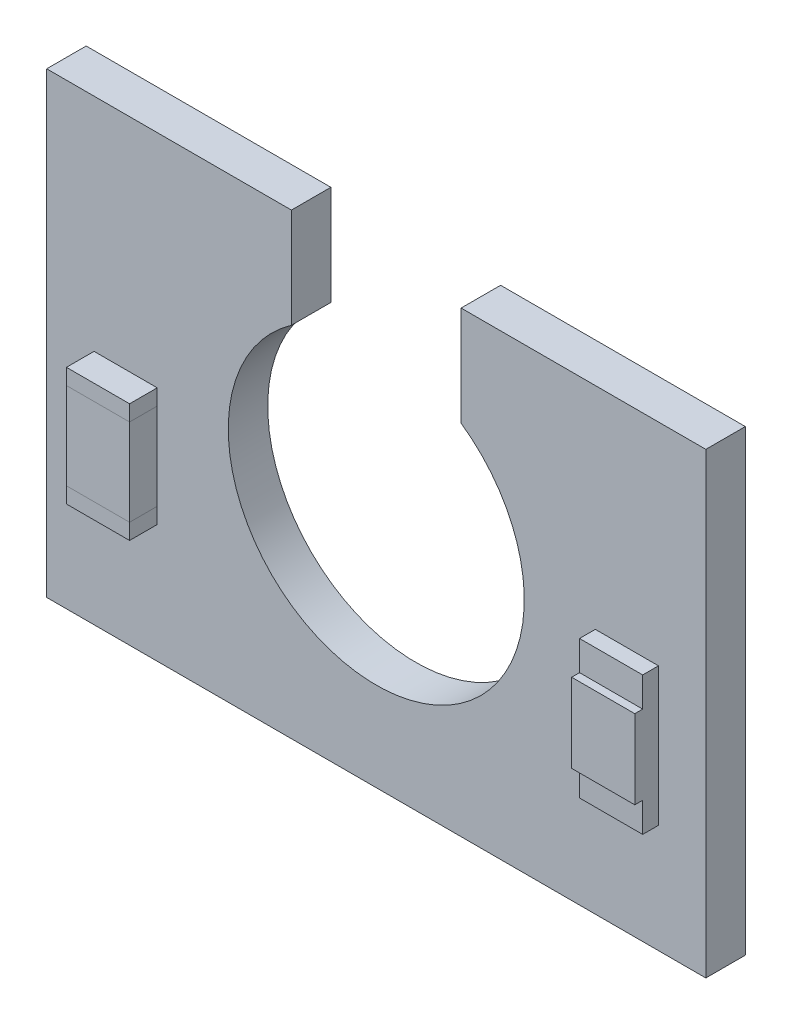
ISO-10303-21;
HEADER;
FILE_DESCRIPTION(('STEP AP214'),'2;1');
FILE_NAME('part.step','',(''),(''),'','','');
FILE_SCHEMA(('AUTOMOTIVE_DESIGN { 1 0 10303 214 1 1 1 1 }'));
ENDSEC;
DATA;
#1=APPLICATION_CONTEXT('core data for automotive mechanical design processes');
#2=APPLICATION_PROTOCOL_DEFINITION('international standard','automotive_design',2000,#1);
#3=PRODUCT_CONTEXT('',#1,'mechanical');
#4=PRODUCT('Part','Part','',(#3));
#5=PRODUCT_RELATED_PRODUCT_CATEGORY('part','',(#4));
#6=PRODUCT_DEFINITION_FORMATION('','',#4);
#7=PRODUCT_DEFINITION_CONTEXT('part definition',#1,'design');
#8=PRODUCT_DEFINITION('design','',#6,#7);
#9=PRODUCT_DEFINITION_SHAPE('','',#8);
#10=(LENGTH_UNIT() NAMED_UNIT(*) SI_UNIT(.MILLI.,.METRE.));
#11=(NAMED_UNIT(*) PLANE_ANGLE_UNIT() SI_UNIT($,.RADIAN.));
#12=(NAMED_UNIT(*) SI_UNIT($,.STERADIAN.) SOLID_ANGLE_UNIT());
#13=UNCERTAINTY_MEASURE_WITH_UNIT(LENGTH_MEASURE(1.E-05),#10,'distance_accuracy_value','');
#14=(GEOMETRIC_REPRESENTATION_CONTEXT(3) GLOBAL_UNCERTAINTY_ASSIGNED_CONTEXT((#13)) GLOBAL_UNIT_ASSIGNED_CONTEXT((#10,
#11,#12)) REPRESENTATION_CONTEXT('',''));
#15=CARTESIAN_POINT('',(0.,0.,0.));
#16=DIRECTION('',(0.,0.,1.));
#17=DIRECTION('',(1.,0.,0.));
#18=AXIS2_PLACEMENT_3D('',#15,#16,#17);
#19=CARTESIAN_POINT('',(-8.35,5.8,-1.));
#20=DIRECTION('',(0.,1.,0.));
#21=DIRECTION('',(0.,0.,1.));
#22=AXIS2_PLACEMENT_3D('',#19,#20,#21);
#23=PLANE('',#22);
#24=DIRECTION('',(0.,0.,1.));
#25=VECTOR('',#24,1.);
#26=CARTESIAN_POINT('',(-2.15,5.8,-1.));
#27=LINE('',#26,#25);
#28=CARTESIAN_POINT('',(-2.15,5.8,-1.));
#29=VERTEX_POINT('',#28);
#30=CARTESIAN_POINT('',(-2.15,5.8,0.));
#31=VERTEX_POINT('',#30);
#32=EDGE_CURVE('P0_E118',#29,#31,#27,.T.);
#33=ORIENTED_EDGE('',*,*,#32,.F.);
#34=DIRECTION('',(-1.,0.,0.));
#35=VECTOR('',#34,1.);
#36=CARTESIAN_POINT('',(-8.35,5.8,-1.));
#37=LINE('',#36,#35);
#38=CARTESIAN_POINT('',(-8.35,5.8,-1.));
#39=VERTEX_POINT('',#38);
#40=EDGE_CURVE('P0_E109',#29,#39,#37,.T.);
#41=ORIENTED_EDGE('',*,*,#40,.T.);
#42=DIRECTION('',(0.,0.,1.));
#43=VECTOR('',#42,1.);
#44=CARTESIAN_POINT('',(-8.35,5.8,-1.));
#45=LINE('',#44,#43);
#46=CARTESIAN_POINT('',(-8.35,5.8,0.));
#47=VERTEX_POINT('',#46);
#48=EDGE_CURVE('P0_E146',#39,#47,#45,.T.);
#49=ORIENTED_EDGE('',*,*,#48,.T.);
#50=DIRECTION('',(-1.,0.,0.));
#51=VECTOR('',#50,1.);
#52=CARTESIAN_POINT('',(-8.35,5.8,0.));
#53=LINE('',#52,#51);
#54=EDGE_CURVE('P0_E137',#31,#47,#53,.T.);
#55=ORIENTED_EDGE('',*,*,#54,.F.);
#56=EDGE_LOOP('',(#33,#41,#49,#55));
#57=FACE_BOUND('',#56,.T.);
#58=ADVANCED_FACE('P0_F17',(#57),#23,.T.);
#59=CARTESIAN_POINT('',(8.35,5.8,-1.));
#60=DIRECTION('',(1.,0.,0.));
#61=DIRECTION('',(0.,0.,-1.));
#62=AXIS2_PLACEMENT_3D('',#59,#60,#61);
#63=PLANE('',#62);
#64=DIRECTION('',(0.,1.,0.));
#65=VECTOR('',#64,1.);
#66=CARTESIAN_POINT('',(8.35,5.8,0.));
#67=LINE('',#66,#65);
#68=CARTESIAN_POINT('',(8.35,-5.8,0.));
#69=VERTEX_POINT('',#68);
#70=CARTESIAN_POINT('',(8.35,5.8,0.));
#71=VERTEX_POINT('',#70);
#72=EDGE_CURVE('P0_E120',#69,#71,#67,.T.);
#73=ORIENTED_EDGE('',*,*,#72,.F.);
#74=DIRECTION('',(0.,0.,1.));
#75=VECTOR('',#74,1.);
#76=CARTESIAN_POINT('',(8.35,-5.8,-1.));
#77=LINE('',#76,#75);
#78=CARTESIAN_POINT('',(8.35,-5.8,-1.));
#79=VERTEX_POINT('',#78);
#80=EDGE_CURVE('P0_E11',#79,#69,#77,.T.);
#81=ORIENTED_EDGE('',*,*,#80,.F.);
#82=DIRECTION('',(0.,1.,0.));
#83=VECTOR('',#82,1.);
#84=CARTESIAN_POINT('',(8.35,5.8,-1.));
#85=LINE('',#84,#83);
#86=CARTESIAN_POINT('',(8.35,5.8,-1.));
#87=VERTEX_POINT('',#86);
#88=EDGE_CURVE('P0_E125',#79,#87,#85,.T.);
#89=ORIENTED_EDGE('',*,*,#88,.T.);
#90=DIRECTION('',(0.,0.,1.));
#91=VECTOR('',#90,1.);
#92=CARTESIAN_POINT('',(8.35,5.8,-1.));
#93=LINE('',#92,#91);
#94=EDGE_CURVE('P0_E21',#87,#71,#93,.T.);
#95=ORIENTED_EDGE('',*,*,#94,.T.);
#96=EDGE_LOOP('',(#73,#81,#89,#95));
#97=FACE_BOUND('',#96,.T.);
#98=ADVANCED_FACE('P0_F19',(#97),#63,.T.);
#99=CARTESIAN_POINT('',(-8.35,-5.8,-1.));
#100=DIRECTION('',(0.,-1.,0.));
#101=DIRECTION('',(0.,0.,-1.));
#102=AXIS2_PLACEMENT_3D('',#99,#100,#101);
#103=PLANE('',#102);
#104=DIRECTION('',(1.,0.,0.));
#105=VECTOR('',#104,1.);
#106=CARTESIAN_POINT('',(-8.35,-5.8,0.));
#107=LINE('',#106,#105);
#108=CARTESIAN_POINT('',(-8.35,-5.8,0.));
#109=VERTEX_POINT('',#108);
#110=EDGE_CURVE('P0_E127',#109,#69,#107,.T.);
#111=ORIENTED_EDGE('',*,*,#110,.F.);
#112=DIRECTION('',(0.,0.,1.));
#113=VECTOR('',#112,1.);
#114=CARTESIAN_POINT('',(-8.35,-5.8,-1.));
#115=LINE('',#114,#113);
#116=CARTESIAN_POINT('',(-8.35,-5.8,-1.));
#117=VERTEX_POINT('',#116);
#118=EDGE_CURVE('P0_E26',#117,#109,#115,.T.);
#119=ORIENTED_EDGE('',*,*,#118,.F.);
#120=DIRECTION('',(1.,0.,0.));
#121=VECTOR('',#120,1.);
#122=CARTESIAN_POINT('',(-8.35,-5.8,-1.));
#123=LINE('',#122,#121);
#124=EDGE_CURVE('P0_E133',#117,#79,#123,.T.);
#125=ORIENTED_EDGE('',*,*,#124,.T.);
#126=ORIENTED_EDGE('',*,*,#80,.T.);
#127=EDGE_LOOP('',(#111,#119,#125,#126));
#128=FACE_BOUND('',#127,.T.);
#129=ADVANCED_FACE('P0_F156',(#128),#103,.T.);
#130=CARTESIAN_POINT('',(-8.35,5.8,-1.));
#131=DIRECTION('',(-1.,0.,0.));
#132=DIRECTION('',(0.,-1.,0.));
#133=AXIS2_PLACEMENT_3D('',#130,#131,#132);
#134=PLANE('',#133);
#135=DIRECTION('',(0.,-1.,0.));
#136=VECTOR('',#135,1.);
#137=CARTESIAN_POINT('',(-8.35,5.8,0.));
#138=LINE('',#137,#136);
#139=EDGE_CURVE('P0_E141',#47,#109,#138,.T.);
#140=ORIENTED_EDGE('',*,*,#139,.F.);
#141=ORIENTED_EDGE('',*,*,#48,.F.);
#142=DIRECTION('',(0.,-1.,0.));
#143=VECTOR('',#142,1.);
#144=CARTESIAN_POINT('',(-8.35,5.8,-1.));
#145=LINE('',#144,#143);
#146=EDGE_CURVE('P0_E130',#39,#117,#145,.T.);
#147=ORIENTED_EDGE('',*,*,#146,.T.);
#148=ORIENTED_EDGE('',*,*,#118,.T.);
#149=EDGE_LOOP('',(#140,#141,#147,#148));
#150=FACE_BOUND('',#149,.T.);
#151=ADVANCED_FACE('P0_F159',(#150),#134,.T.);
#152=DIRECTION('',(0.,0.,1.));
#153=VECTOR('',#152,1.);
#154=CARTESIAN_POINT('',(2.15,5.8,-1.));
#155=LINE('',#154,#153);
#156=CARTESIAN_POINT('',(2.15,5.8,-1.));
#157=VERTEX_POINT('',#156);
#158=CARTESIAN_POINT('',(2.15,5.8,0.));
#159=VERTEX_POINT('',#158);
#160=EDGE_CURVE('P0_E121',#157,#159,#155,.T.);
#161=ORIENTED_EDGE('',*,*,#160,.T.);
#162=EDGE_CURVE('P0_E138',#71,#159,#53,.T.);
#163=ORIENTED_EDGE('',*,*,#162,.F.);
#164=ORIENTED_EDGE('',*,*,#94,.F.);
#165=EDGE_CURVE('P0_E128',#87,#157,#37,.T.);
#166=ORIENTED_EDGE('',*,*,#165,.T.);
#167=EDGE_LOOP('',(#161,#163,#164,#166));
#168=FACE_BOUND('',#167,.T.);
#169=ADVANCED_FACE('P0_F152',(#168),#23,.T.);
#170=CARTESIAN_POINT('',(0.,0.,-1.));
#171=DIRECTION('',(0.,0.,1.));
#172=DIRECTION('',(1.,0.,0.));
#173=AXIS2_PLACEMENT_3D('',#170,#171,#172);
#174=PLANE('',#173);
#175=ORIENTED_EDGE('',*,*,#40,.F.);
#176=DIRECTION('',(0.,-1.,0.));
#177=VECTOR('',#176,1.);
#178=CARTESIAN_POINT('',(-2.15,5.8,-1.));
#179=LINE('',#178,#177);
#180=CARTESIAN_POINT('',(-2.15,3.27245829914745,-1.));
#181=VERTEX_POINT('',#180);
#182=EDGE_CURVE('P0_E91',#29,#181,#179,.T.);
#183=ORIENTED_EDGE('',*,*,#182,.T.);
#184=CARTESIAN_POINT('',(0.,0.200000000000002,-1.));
#185=DIRECTION('',(0.,0.,1.));
#186=DIRECTION('',(1.,0.,0.));
#187=AXIS2_PLACEMENT_3D('',#184,#185,#186);
#188=CIRCLE('',#187,3.75);
#189=CARTESIAN_POINT('',(2.15,3.27245829914744,-1.));
#190=VERTEX_POINT('',#189);
#191=EDGE_CURVE('P0_E100',#181,#190,#188,.T.);
#192=ORIENTED_EDGE('',*,*,#191,.T.);
#193=DIRECTION('',(0.,1.,0.));
#194=VECTOR('',#193,1.);
#195=CARTESIAN_POINT('',(2.15,5.8,-1.));
#196=LINE('',#195,#194);
#197=EDGE_CURVE('P0_E97',#190,#157,#196,.T.);
#198=ORIENTED_EDGE('',*,*,#197,.T.);
#199=ORIENTED_EDGE('',*,*,#165,.F.);
#200=ORIENTED_EDGE('',*,*,#88,.F.);
#201=ORIENTED_EDGE('',*,*,#124,.F.);
#202=ORIENTED_EDGE('',*,*,#146,.F.);
#203=EDGE_LOOP('',(#175,#183,#192,#198,#199,#200,#201,#202));
#204=FACE_BOUND('',#203,.T.);
#205=ADVANCED_FACE('P0_F107',(#204),#174,.F.);
#206=CARTESIAN_POINT('',(0.,0.,0.));
#207=DIRECTION('',(0.,0.,1.));
#208=DIRECTION('',(1.,0.,0.));
#209=AXIS2_PLACEMENT_3D('',#206,#207,#208);
#210=PLANE('',#209);
#211=DIRECTION('',(0.,-1.,0.));
#212=VECTOR('',#211,1.);
#213=CARTESIAN_POINT('',(-2.15,5.8,0.));
#214=LINE('',#213,#212);
#215=CARTESIAN_POINT('',(-2.15,3.27245829914745,0.));
#216=VERTEX_POINT('',#215);
#217=EDGE_CURVE('P0_E34',#31,#216,#214,.T.);
#218=ORIENTED_EDGE('',*,*,#217,.F.);
#219=ORIENTED_EDGE('',*,*,#54,.T.);
#220=ORIENTED_EDGE('',*,*,#139,.T.);
#221=ORIENTED_EDGE('',*,*,#110,.T.);
#222=ORIENTED_EDGE('',*,*,#72,.T.);
#223=ORIENTED_EDGE('',*,*,#162,.T.);
#224=DIRECTION('',(0.,1.,0.));
#225=VECTOR('',#224,1.);
#226=CARTESIAN_POINT('',(2.15,5.8,0.));
#227=LINE('',#226,#225);
#228=CARTESIAN_POINT('',(2.15,3.27245829914744,0.));
#229=VERTEX_POINT('',#228);
#230=EDGE_CURVE('P0_E110',#229,#159,#227,.T.);
#231=ORIENTED_EDGE('',*,*,#230,.F.);
#232=CARTESIAN_POINT('',(0.,0.200000000000002,0.));
#233=DIRECTION('',(0.,0.,1.));
#234=DIRECTION('',(1.,0.,0.));
#235=AXIS2_PLACEMENT_3D('',#232,#233,#234);
#236=CIRCLE('',#235,3.75);
#237=EDGE_CURVE('P0_E112',#216,#229,#236,.T.);
#238=ORIENTED_EDGE('',*,*,#237,.F.);
#239=EDGE_LOOP('',(#218,#219,#220,#221,#222,#223,#231,#238));
#240=FACE_BOUND('',#239,.T.);
#241=ADVANCED_FACE('P0_F155',(#240),#210,.T.);
#242=CARTESIAN_POINT('',(-2.15,5.8,-1.));
#243=DIRECTION('',(-1.,0.,0.));
#244=DIRECTION('',(0.,-1.,0.));
#245=AXIS2_PLACEMENT_3D('',#242,#243,#244);
#246=PLANE('',#245);
#247=ORIENTED_EDGE('',*,*,#217,.T.);
#248=DIRECTION('',(0.,0.,1.));
#249=VECTOR('',#248,1.);
#250=CARTESIAN_POINT('',(-2.15,3.27245829914745,-1.));
#251=LINE('',#250,#249);
#252=EDGE_CURVE('P0_E87',#181,#216,#251,.T.);
#253=ORIENTED_EDGE('',*,*,#252,.F.);
#254=ORIENTED_EDGE('',*,*,#182,.F.);
#255=ORIENTED_EDGE('',*,*,#32,.T.);
#256=EDGE_LOOP('',(#247,#253,#254,#255));
#257=FACE_BOUND('',#256,.T.);
#258=ADVANCED_FACE('P0_F89',(#257),#246,.F.);
#259=CARTESIAN_POINT('',(2.15,5.8,-1.));
#260=DIRECTION('',(1.,0.,0.));
#261=DIRECTION('',(0.,1.,0.));
#262=AXIS2_PLACEMENT_3D('',#259,#260,#261);
#263=PLANE('',#262);
#264=ORIENTED_EDGE('',*,*,#230,.T.);
#265=ORIENTED_EDGE('',*,*,#160,.F.);
#266=ORIENTED_EDGE('',*,*,#197,.F.);
#267=DIRECTION('',(0.,0.,1.));
#268=VECTOR('',#267,1.);
#269=CARTESIAN_POINT('',(2.15,3.27245829914744,-1.));
#270=LINE('',#269,#268);
#271=EDGE_CURVE('P0_E96',#190,#229,#270,.T.);
#272=ORIENTED_EDGE('',*,*,#271,.T.);
#273=EDGE_LOOP('',(#264,#265,#266,#272));
#274=FACE_BOUND('',#273,.T.);
#275=ADVANCED_FACE('P0_F161',(#274),#263,.F.);
#276=CARTESIAN_POINT('',(0.,0.200000000000002,-1.));
#277=DIRECTION('',(0.,0.,1.));
#278=DIRECTION('',(1.,0.,0.));
#279=AXIS2_PLACEMENT_3D('',#276,#277,#278);
#280=CYLINDRICAL_SURFACE('',#279,3.75);
#281=ORIENTED_EDGE('',*,*,#237,.T.);
#282=ORIENTED_EDGE('',*,*,#271,.F.);
#283=ORIENTED_EDGE('',*,*,#191,.F.);
#284=ORIENTED_EDGE('',*,*,#252,.T.);
#285=EDGE_LOOP('',(#281,#282,#283,#284));
#286=FACE_BOUND('',#285,.T.);
#287=ADVANCED_FACE('P0_F101',(#286),#280,.F.);
#288=CLOSED_SHELL('',(#58,#98,#129,#151,#169,#205,#241,#258,#275,#287));
#289=MANIFOLD_SOLID_BREP('P0_B1',#288);
#290=CARTESIAN_POINT('',(-5.55,-0.199999999999999,0.7));
#291=DIRECTION('',(-1.,0.,0.));
#292=DIRECTION('',(0.,0.,1.));
#293=AXIS2_PLACEMENT_3D('',#290,#291,#292);
#294=PLANE('',#293);
#295=DIRECTION('',(0.,1.,0.));
#296=VECTOR('',#295,1.);
#297=CARTESIAN_POINT('',(-5.55,-0.199999999999999,0.));
#298=LINE('',#297,#296);
#299=CARTESIAN_POINT('',(-5.55,-2.4,0.));
#300=VERTEX_POINT('',#299);
#301=CARTESIAN_POINT('',(-5.55,-0.199999999999999,0.));
#302=VERTEX_POINT('',#301);
#303=EDGE_CURVE('P1_E80',#300,#302,#298,.T.);
#304=ORIENTED_EDGE('',*,*,#303,.T.);
#305=DIRECTION('',(0.,0.,-1.));
#306=VECTOR('',#305,1.);
#307=CARTESIAN_POINT('',(-5.55,-0.199999999999999,0.7));
#308=LINE('',#307,#306);
#309=CARTESIAN_POINT('',(-5.55,-0.199999999999999,0.7));
#310=VERTEX_POINT('',#309);
#311=EDGE_CURVE('P1_E11',#310,#302,#308,.T.);
#312=ORIENTED_EDGE('',*,*,#311,.F.);
#313=DIRECTION('',(0.,1.,0.));
#314=VECTOR('',#313,1.);
#315=CARTESIAN_POINT('',(-5.55,-0.199999999999999,0.7));
#316=LINE('',#315,#314);
#317=CARTESIAN_POINT('',(-5.55,-2.4,0.7));
#318=VERTEX_POINT('',#317);
#319=EDGE_CURVE('P1_E68',#318,#310,#316,.T.);
#320=ORIENTED_EDGE('',*,*,#319,.F.);
#321=DIRECTION('',(0.,0.,-1.));
#322=VECTOR('',#321,1.);
#323=CARTESIAN_POINT('',(-5.55,-2.4,0.7));
#324=LINE('',#323,#322);
#325=EDGE_CURVE('P1_E76',#318,#300,#324,.T.);
#326=ORIENTED_EDGE('',*,*,#325,.T.);
#327=EDGE_LOOP('',(#304,#312,#320,#326));
#328=FACE_BOUND('',#327,.T.);
#329=ADVANCED_FACE('P1_F17',(#328),#294,.F.);
#330=CARTESIAN_POINT('',(-7.15,-0.199999999999999,0.7));
#331=DIRECTION('',(0.,-1.,0.));
#332=DIRECTION('',(0.,0.,-1.));
#333=AXIS2_PLACEMENT_3D('',#330,#331,#332);
#334=PLANE('',#333);
#335=DIRECTION('',(-1.,0.,0.));
#336=VECTOR('',#335,1.);
#337=CARTESIAN_POINT('',(-7.15,-0.199999999999999,0.));
#338=LINE('',#337,#336);
#339=CARTESIAN_POINT('',(-7.15,-0.199999999999999,0.));
#340=VERTEX_POINT('',#339);
#341=EDGE_CURVE('P1_E72',#302,#340,#338,.T.);
#342=ORIENTED_EDGE('',*,*,#341,.T.);
#343=DIRECTION('',(0.,0.,-1.));
#344=VECTOR('',#343,1.);
#345=CARTESIAN_POINT('',(-7.15,-0.199999999999999,0.7));
#346=LINE('',#345,#344);
#347=CARTESIAN_POINT('',(-7.15,-0.199999999999999,0.7));
#348=VERTEX_POINT('',#347);
#349=EDGE_CURVE('P1_E25',#348,#340,#346,.T.);
#350=ORIENTED_EDGE('',*,*,#349,.F.);
#351=DIRECTION('',(-1.,0.,0.));
#352=VECTOR('',#351,1.);
#353=CARTESIAN_POINT('',(-7.15,-0.199999999999999,0.7));
#354=LINE('',#353,#352);
#355=EDGE_CURVE('P1_E63',#310,#348,#354,.T.);
#356=ORIENTED_EDGE('',*,*,#355,.F.);
#357=ORIENTED_EDGE('',*,*,#311,.T.);
#358=EDGE_LOOP('',(#342,#350,#356,#357));
#359=FACE_BOUND('',#358,.T.);
#360=ADVANCED_FACE('P1_F71',(#359),#334,.F.);
#361=CARTESIAN_POINT('',(-7.15,-0.199999999999999,0.7));
#362=DIRECTION('',(1.,0.,0.));
#363=DIRECTION('',(0.,0.,-1.));
#364=AXIS2_PLACEMENT_3D('',#361,#362,#363);
#365=PLANE('',#364);
#366=DIRECTION('',(0.,-1.,0.));
#367=VECTOR('',#366,1.);
#368=CARTESIAN_POINT('',(-7.15,-0.199999999999999,0.));
#369=LINE('',#368,#367);
#370=CARTESIAN_POINT('',(-7.15,-2.4,0.));
#371=VERTEX_POINT('',#370);
#372=EDGE_CURVE('P1_E50',#340,#371,#369,.T.);
#373=ORIENTED_EDGE('',*,*,#372,.T.);
#374=DIRECTION('',(0.,0.,-1.));
#375=VECTOR('',#374,1.);
#376=CARTESIAN_POINT('',(-7.15,-2.4,0.7));
#377=LINE('',#376,#375);
#378=CARTESIAN_POINT('',(-7.15,-2.4,0.7));
#379=VERTEX_POINT('',#378);
#380=EDGE_CURVE('P1_E73',#379,#371,#377,.T.);
#381=ORIENTED_EDGE('',*,*,#380,.F.);
#382=DIRECTION('',(0.,-1.,0.));
#383=VECTOR('',#382,1.);
#384=CARTESIAN_POINT('',(-7.15,-0.199999999999999,0.7));
#385=LINE('',#384,#383);
#386=EDGE_CURVE('P1_E66',#348,#379,#385,.T.);
#387=ORIENTED_EDGE('',*,*,#386,.F.);
#388=ORIENTED_EDGE('',*,*,#349,.T.);
#389=EDGE_LOOP('',(#373,#381,#387,#388));
#390=FACE_BOUND('',#389,.T.);
#391=ADVANCED_FACE('P1_F74',(#390),#365,.F.);
#392=CARTESIAN_POINT('',(-7.15,-2.4,0.7));
#393=DIRECTION('',(0.,1.,0.));
#394=DIRECTION('',(0.,0.,1.));
#395=AXIS2_PLACEMENT_3D('',#392,#393,#394);
#396=PLANE('',#395);
#397=DIRECTION('',(1.,0.,0.));
#398=VECTOR('',#397,1.);
#399=CARTESIAN_POINT('',(-7.15,-2.4,0.));
#400=LINE('',#399,#398);
#401=EDGE_CURVE('P1_E56',#371,#300,#400,.T.);
#402=ORIENTED_EDGE('',*,*,#401,.T.);
#403=ORIENTED_EDGE('',*,*,#325,.F.);
#404=DIRECTION('',(1.,0.,0.));
#405=VECTOR('',#404,1.);
#406=CARTESIAN_POINT('',(-7.15,-2.4,0.7));
#407=LINE('',#406,#405);
#408=EDGE_CURVE('P1_E33',#379,#318,#407,.T.);
#409=ORIENTED_EDGE('',*,*,#408,.F.);
#410=ORIENTED_EDGE('',*,*,#380,.T.);
#411=EDGE_LOOP('',(#402,#403,#409,#410));
#412=FACE_BOUND('',#411,.T.);
#413=ADVANCED_FACE('P1_F87',(#412),#396,.F.);
#414=CARTESIAN_POINT('',(0.,0.,0.7));
#415=DIRECTION('',(0.,0.,1.));
#416=DIRECTION('',(1.,0.,0.));
#417=AXIS2_PLACEMENT_3D('',#414,#415,#416);
#418=PLANE('',#417);
#419=ORIENTED_EDGE('',*,*,#319,.T.);
#420=ORIENTED_EDGE('',*,*,#355,.T.);
#421=ORIENTED_EDGE('',*,*,#386,.T.);
#422=ORIENTED_EDGE('',*,*,#408,.T.);
#423=EDGE_LOOP('',(#419,#420,#421,#422));
#424=FACE_BOUND('',#423,.T.);
#425=ADVANCED_FACE('P1_F64',(#424),#418,.T.);
#426=CARTESIAN_POINT('',(0.,0.,0.));
#427=DIRECTION('',(0.,0.,1.));
#428=DIRECTION('',(1.,0.,0.));
#429=AXIS2_PLACEMENT_3D('',#426,#427,#428);
#430=PLANE('',#429);
#431=ORIENTED_EDGE('',*,*,#303,.F.);
#432=ORIENTED_EDGE('',*,*,#401,.F.);
#433=ORIENTED_EDGE('',*,*,#372,.F.);
#434=ORIENTED_EDGE('',*,*,#341,.F.);
#435=EDGE_LOOP('',(#431,#432,#433,#434));
#436=FACE_BOUND('',#435,.T.);
#437=ADVANCED_FACE('P1_F90',(#436),#430,.F.);
#438=CLOSED_SHELL('',(#329,#360,#391,#413,#425,#437));
#439=MANIFOLD_SOLID_BREP('P1_B1',#438);
#440=CARTESIAN_POINT('',(-7.15,-2.8,0.7));
#441=DIRECTION('',(1.,0.,0.));
#442=DIRECTION('',(0.,0.,-1.));
#443=AXIS2_PLACEMENT_3D('',#440,#441,#442);
#444=PLANE('',#443);
#445=DIRECTION('',(0.,0.,-1.));
#446=VECTOR('',#445,1.);
#447=CARTESIAN_POINT('',(-7.15,-2.4,0.7));
#448=LINE('',#447,#446);
#449=CARTESIAN_POINT('',(-7.15,-2.4,0.7));
#450=VERTEX_POINT('',#449);
#451=CARTESIAN_POINT('',(-7.15,-2.4,0.));
#452=VERTEX_POINT('',#451);
#453=EDGE_CURVE('P2_E80',#450,#452,#448,.T.);
#454=ORIENTED_EDGE('',*,*,#453,.T.);
#455=DIRECTION('',(0.,1.,0.));
#456=VECTOR('',#455,1.);
#457=CARTESIAN_POINT('',(-7.15,-2.8,0.));
#458=LINE('',#457,#456);
#459=CARTESIAN_POINT('',(-7.15,-2.8,0.));
#460=VERTEX_POINT('',#459);
#461=EDGE_CURVE('P2_E11',#460,#452,#458,.T.);
#462=ORIENTED_EDGE('',*,*,#461,.F.);
#463=DIRECTION('',(0.,0.,-1.));
#464=VECTOR('',#463,1.);
#465=CARTESIAN_POINT('',(-7.15,-2.8,0.7));
#466=LINE('',#465,#464);
#467=CARTESIAN_POINT('',(-7.15,-2.8,0.7));
#468=VERTEX_POINT('',#467);
#469=EDGE_CURVE('P2_E68',#468,#460,#466,.T.);
#470=ORIENTED_EDGE('',*,*,#469,.F.);
#471=DIRECTION('',(0.,1.,0.));
#472=VECTOR('',#471,1.);
#473=CARTESIAN_POINT('',(-7.15,-2.8,0.7));
#474=LINE('',#473,#472);
#475=EDGE_CURVE('P2_E76',#468,#450,#474,.T.);
#476=ORIENTED_EDGE('',*,*,#475,.T.);
#477=EDGE_LOOP('',(#454,#462,#470,#476));
#478=FACE_BOUND('',#477,.T.);
#479=ADVANCED_FACE('P2_F17',(#478),#444,.F.);
#480=CARTESIAN_POINT('',(-7.15,-2.8,0.));
#481=DIRECTION('',(0.,0.,1.));
#482=DIRECTION('',(1.,0.,0.));
#483=AXIS2_PLACEMENT_3D('',#480,#481,#482);
#484=PLANE('',#483);
#485=DIRECTION('',(1.,0.,0.));
#486=VECTOR('',#485,1.);
#487=CARTESIAN_POINT('',(-7.15,-2.4,0.));
#488=LINE('',#487,#486);
#489=CARTESIAN_POINT('',(-5.55,-2.4,0.));
#490=VERTEX_POINT('',#489);
#491=EDGE_CURVE('P2_E72',#452,#490,#488,.T.);
#492=ORIENTED_EDGE('',*,*,#491,.T.);
#493=DIRECTION('',(0.,1.,0.));
#494=VECTOR('',#493,1.);
#495=CARTESIAN_POINT('',(-5.55,-2.8,0.));
#496=LINE('',#495,#494);
#497=CARTESIAN_POINT('',(-5.55,-2.8,0.));
#498=VERTEX_POINT('',#497);
#499=EDGE_CURVE('P2_E25',#498,#490,#496,.T.);
#500=ORIENTED_EDGE('',*,*,#499,.F.);
#501=DIRECTION('',(1.,0.,0.));
#502=VECTOR('',#501,1.);
#503=CARTESIAN_POINT('',(-7.15,-2.8,0.));
#504=LINE('',#503,#502);
#505=EDGE_CURVE('P2_E63',#460,#498,#504,.T.);
#506=ORIENTED_EDGE('',*,*,#505,.F.);
#507=ORIENTED_EDGE('',*,*,#461,.T.);
#508=EDGE_LOOP('',(#492,#500,#506,#507));
#509=FACE_BOUND('',#508,.T.);
#510=ADVANCED_FACE('P2_F71',(#509),#484,.F.);
#511=CARTESIAN_POINT('',(-5.55,-2.8,0.));
#512=DIRECTION('',(-1.,0.,0.));
#513=DIRECTION('',(0.,0.,1.));
#514=AXIS2_PLACEMENT_3D('',#511,#512,#513);
#515=PLANE('',#514);
#516=DIRECTION('',(0.,0.,1.));
#517=VECTOR('',#516,1.);
#518=CARTESIAN_POINT('',(-5.55,-2.4,0.));
#519=LINE('',#518,#517);
#520=CARTESIAN_POINT('',(-5.55,-2.4,0.7));
#521=VERTEX_POINT('',#520);
#522=EDGE_CURVE('P2_E50',#490,#521,#519,.T.);
#523=ORIENTED_EDGE('',*,*,#522,.T.);
#524=DIRECTION('',(0.,1.,0.));
#525=VECTOR('',#524,1.);
#526=CARTESIAN_POINT('',(-5.55,-2.8,0.7));
#527=LINE('',#526,#525);
#528=CARTESIAN_POINT('',(-5.55,-2.8,0.7));
#529=VERTEX_POINT('',#528);
#530=EDGE_CURVE('P2_E73',#529,#521,#527,.T.);
#531=ORIENTED_EDGE('',*,*,#530,.F.);
#532=DIRECTION('',(0.,0.,1.));
#533=VECTOR('',#532,1.);
#534=CARTESIAN_POINT('',(-5.55,-2.8,0.));
#535=LINE('',#534,#533);
#536=EDGE_CURVE('P2_E66',#498,#529,#535,.T.);
#537=ORIENTED_EDGE('',*,*,#536,.F.);
#538=ORIENTED_EDGE('',*,*,#499,.T.);
#539=EDGE_LOOP('',(#523,#531,#537,#538));
#540=FACE_BOUND('',#539,.T.);
#541=ADVANCED_FACE('P2_F74',(#540),#515,.F.);
#542=CARTESIAN_POINT('',(-5.55,-2.8,0.7));
#543=DIRECTION('',(0.,0.,-1.));
#544=DIRECTION('',(-1.,0.,0.));
#545=AXIS2_PLACEMENT_3D('',#542,#543,#544);
#546=PLANE('',#545);
#547=DIRECTION('',(-1.,0.,0.));
#548=VECTOR('',#547,1.);
#549=CARTESIAN_POINT('',(-5.55,-2.4,0.7));
#550=LINE('',#549,#548);
#551=EDGE_CURVE('P2_E56',#521,#450,#550,.T.);
#552=ORIENTED_EDGE('',*,*,#551,.T.);
#553=ORIENTED_EDGE('',*,*,#475,.F.);
#554=DIRECTION('',(-1.,0.,0.));
#555=VECTOR('',#554,1.);
#556=CARTESIAN_POINT('',(-5.55,-2.8,0.7));
#557=LINE('',#556,#555);
#558=EDGE_CURVE('P2_E33',#529,#468,#557,.T.);
#559=ORIENTED_EDGE('',*,*,#558,.F.);
#560=ORIENTED_EDGE('',*,*,#530,.T.);
#561=EDGE_LOOP('',(#552,#553,#559,#560));
#562=FACE_BOUND('',#561,.T.);
#563=ADVANCED_FACE('P2_F87',(#562),#546,.F.);
#564=CARTESIAN_POINT('',(0.,-2.8,0.));
#565=DIRECTION('',(0.,-1.,0.));
#566=DIRECTION('',(0.,0.,-1.));
#567=AXIS2_PLACEMENT_3D('',#564,#565,#566);
#568=PLANE('',#567);
#569=ORIENTED_EDGE('',*,*,#469,.T.);
#570=ORIENTED_EDGE('',*,*,#505,.T.);
#571=ORIENTED_EDGE('',*,*,#536,.T.);
#572=ORIENTED_EDGE('',*,*,#558,.T.);
#573=EDGE_LOOP('',(#569,#570,#571,#572));
#574=FACE_BOUND('',#573,.T.);
#575=ADVANCED_FACE('P2_F64',(#574),#568,.T.);
#576=CARTESIAN_POINT('',(0.,-2.4,0.));
#577=DIRECTION('',(0.,-1.,0.));
#578=DIRECTION('',(0.,0.,-1.));
#579=AXIS2_PLACEMENT_3D('',#576,#577,#578);
#580=PLANE('',#579);
#581=ORIENTED_EDGE('',*,*,#453,.F.);
#582=ORIENTED_EDGE('',*,*,#551,.F.);
#583=ORIENTED_EDGE('',*,*,#522,.F.);
#584=ORIENTED_EDGE('',*,*,#491,.F.);
#585=EDGE_LOOP('',(#581,#582,#583,#584));
#586=FACE_BOUND('',#585,.T.);
#587=ADVANCED_FACE('P2_F90',(#586),#580,.F.);
#588=CLOSED_SHELL('',(#479,#510,#541,#563,#575,#587));
#589=MANIFOLD_SOLID_BREP('P2_B1',#588);
#590=CARTESIAN_POINT('',(-5.55,0.200000000000001,0.7));
#591=DIRECTION('',(-1.,0.,0.));
#592=DIRECTION('',(0.,0.,1.));
#593=AXIS2_PLACEMENT_3D('',#590,#591,#592);
#594=PLANE('',#593);
#595=DIRECTION('',(0.,0.,-1.));
#596=VECTOR('',#595,1.);
#597=CARTESIAN_POINT('',(-5.55,-0.199999999999999,0.7));
#598=LINE('',#597,#596);
#599=CARTESIAN_POINT('',(-5.55,-0.199999999999999,0.7));
#600=VERTEX_POINT('',#599);
#601=CARTESIAN_POINT('',(-5.55,-0.199999999999999,0.));
#602=VERTEX_POINT('',#601);
#603=EDGE_CURVE('P3_E80',#600,#602,#598,.T.);
#604=ORIENTED_EDGE('',*,*,#603,.T.);
#605=DIRECTION('',(0.,-1.,0.));
#606=VECTOR('',#605,1.);
#607=CARTESIAN_POINT('',(-5.55,0.200000000000001,0.));
#608=LINE('',#607,#606);
#609=CARTESIAN_POINT('',(-5.55,0.200000000000001,0.));
#610=VERTEX_POINT('',#609);
#611=EDGE_CURVE('P3_E11',#610,#602,#608,.T.);
#612=ORIENTED_EDGE('',*,*,#611,.F.);
#613=DIRECTION('',(0.,0.,-1.));
#614=VECTOR('',#613,1.);
#615=CARTESIAN_POINT('',(-5.55,0.200000000000001,0.7));
#616=LINE('',#615,#614);
#617=CARTESIAN_POINT('',(-5.55,0.200000000000001,0.7));
#618=VERTEX_POINT('',#617);
#619=EDGE_CURVE('P3_E68',#618,#610,#616,.T.);
#620=ORIENTED_EDGE('',*,*,#619,.F.);
#621=DIRECTION('',(0.,-1.,0.));
#622=VECTOR('',#621,1.);
#623=CARTESIAN_POINT('',(-5.55,0.200000000000001,0.7));
#624=LINE('',#623,#622);
#625=EDGE_CURVE('P3_E76',#618,#600,#624,.T.);
#626=ORIENTED_EDGE('',*,*,#625,.T.);
#627=EDGE_LOOP('',(#604,#612,#620,#626));
#628=FACE_BOUND('',#627,.T.);
#629=ADVANCED_FACE('P3_F17',(#628),#594,.F.);
#630=CARTESIAN_POINT('',(-5.55,0.200000000000001,0.));
#631=DIRECTION('',(0.,0.,1.));
#632=DIRECTION('',(1.,0.,0.));
#633=AXIS2_PLACEMENT_3D('',#630,#631,#632);
#634=PLANE('',#633);
#635=DIRECTION('',(-1.,0.,0.));
#636=VECTOR('',#635,1.);
#637=CARTESIAN_POINT('',(-5.55,-0.199999999999999,0.));
#638=LINE('',#637,#636);
#639=CARTESIAN_POINT('',(-7.15,-0.199999999999999,0.));
#640=VERTEX_POINT('',#639);
#641=EDGE_CURVE('P3_E72',#602,#640,#638,.T.);
#642=ORIENTED_EDGE('',*,*,#641,.T.);
#643=DIRECTION('',(0.,-1.,0.));
#644=VECTOR('',#643,1.);
#645=CARTESIAN_POINT('',(-7.15,0.200000000000001,0.));
#646=LINE('',#645,#644);
#647=CARTESIAN_POINT('',(-7.15,0.200000000000001,0.));
#648=VERTEX_POINT('',#647);
#649=EDGE_CURVE('P3_E25',#648,#640,#646,.T.);
#650=ORIENTED_EDGE('',*,*,#649,.F.);
#651=DIRECTION('',(-1.,0.,0.));
#652=VECTOR('',#651,1.);
#653=CARTESIAN_POINT('',(-5.55,0.200000000000001,0.));
#654=LINE('',#653,#652);
#655=EDGE_CURVE('P3_E63',#610,#648,#654,.T.);
#656=ORIENTED_EDGE('',*,*,#655,.F.);
#657=ORIENTED_EDGE('',*,*,#611,.T.);
#658=EDGE_LOOP('',(#642,#650,#656,#657));
#659=FACE_BOUND('',#658,.T.);
#660=ADVANCED_FACE('P3_F71',(#659),#634,.F.);
#661=CARTESIAN_POINT('',(-7.15,0.200000000000001,0.));
#662=DIRECTION('',(1.,0.,0.));
#663=DIRECTION('',(0.,0.,-1.));
#664=AXIS2_PLACEMENT_3D('',#661,#662,#663);
#665=PLANE('',#664);
#666=DIRECTION('',(0.,0.,1.));
#667=VECTOR('',#666,1.);
#668=CARTESIAN_POINT('',(-7.15,-0.199999999999999,0.));
#669=LINE('',#668,#667);
#670=CARTESIAN_POINT('',(-7.15,-0.199999999999999,0.7));
#671=VERTEX_POINT('',#670);
#672=EDGE_CURVE('P3_E50',#640,#671,#669,.T.);
#673=ORIENTED_EDGE('',*,*,#672,.T.);
#674=DIRECTION('',(0.,-1.,0.));
#675=VECTOR('',#674,1.);
#676=CARTESIAN_POINT('',(-7.15,0.200000000000001,0.7));
#677=LINE('',#676,#675);
#678=CARTESIAN_POINT('',(-7.15,0.200000000000001,0.7));
#679=VERTEX_POINT('',#678);
#680=EDGE_CURVE('P3_E73',#679,#671,#677,.T.);
#681=ORIENTED_EDGE('',*,*,#680,.F.);
#682=DIRECTION('',(0.,0.,1.));
#683=VECTOR('',#682,1.);
#684=CARTESIAN_POINT('',(-7.15,0.200000000000001,0.));
#685=LINE('',#684,#683);
#686=EDGE_CURVE('P3_E66',#648,#679,#685,.T.);
#687=ORIENTED_EDGE('',*,*,#686,.F.);
#688=ORIENTED_EDGE('',*,*,#649,.T.);
#689=EDGE_LOOP('',(#673,#681,#687,#688));
#690=FACE_BOUND('',#689,.T.);
#691=ADVANCED_FACE('P3_F74',(#690),#665,.F.);
#692=CARTESIAN_POINT('',(-7.15,0.200000000000001,0.7));
#693=DIRECTION('',(0.,0.,-1.));
#694=DIRECTION('',(-1.,0.,0.));
#695=AXIS2_PLACEMENT_3D('',#692,#693,#694);
#696=PLANE('',#695);
#697=DIRECTION('',(1.,0.,0.));
#698=VECTOR('',#697,1.);
#699=CARTESIAN_POINT('',(-7.15,-0.199999999999999,0.7));
#700=LINE('',#699,#698);
#701=EDGE_CURVE('P3_E56',#671,#600,#700,.T.);
#702=ORIENTED_EDGE('',*,*,#701,.T.);
#703=ORIENTED_EDGE('',*,*,#625,.F.);
#704=DIRECTION('',(1.,0.,0.));
#705=VECTOR('',#704,1.);
#706=CARTESIAN_POINT('',(-7.15,0.200000000000001,0.7));
#707=LINE('',#706,#705);
#708=EDGE_CURVE('P3_E33',#679,#618,#707,.T.);
#709=ORIENTED_EDGE('',*,*,#708,.F.);
#710=ORIENTED_EDGE('',*,*,#680,.T.);
#711=EDGE_LOOP('',(#702,#703,#709,#710));
#712=FACE_BOUND('',#711,.T.);
#713=ADVANCED_FACE('P3_F87',(#712),#696,.F.);
#714=CARTESIAN_POINT('',(0.,0.200000000000001,0.));
#715=DIRECTION('',(0.,1.,0.));
#716=DIRECTION('',(0.,0.,1.));
#717=AXIS2_PLACEMENT_3D('',#714,#715,#716);
#718=PLANE('',#717);
#719=ORIENTED_EDGE('',*,*,#619,.T.);
#720=ORIENTED_EDGE('',*,*,#655,.T.);
#721=ORIENTED_EDGE('',*,*,#686,.T.);
#722=ORIENTED_EDGE('',*,*,#708,.T.);
#723=EDGE_LOOP('',(#719,#720,#721,#722));
#724=FACE_BOUND('',#723,.T.);
#725=ADVANCED_FACE('P3_F64',(#724),#718,.T.);
#726=CARTESIAN_POINT('',(0.,-0.199999999999999,0.));
#727=DIRECTION('',(0.,1.,0.));
#728=DIRECTION('',(0.,0.,1.));
#729=AXIS2_PLACEMENT_3D('',#726,#727,#728);
#730=PLANE('',#729);
#731=ORIENTED_EDGE('',*,*,#603,.F.);
#732=ORIENTED_EDGE('',*,*,#701,.F.);
#733=ORIENTED_EDGE('',*,*,#672,.F.);
#734=ORIENTED_EDGE('',*,*,#641,.F.);
#735=EDGE_LOOP('',(#731,#732,#733,#734));
#736=FACE_BOUND('',#735,.T.);
#737=ADVANCED_FACE('P3_F90',(#736),#730,.F.);
#738=CLOSED_SHELL('',(#629,#660,#691,#713,#725,#737));
#739=MANIFOLD_SOLID_BREP('P3_B1',#738);
#740=CARTESIAN_POINT('',(0.,0.,0.4));
#741=DIRECTION('',(0.,0.,1.));
#742=DIRECTION('',(1.,0.,0.));
#743=AXIS2_PLACEMENT_3D('',#740,#741,#742);
#744=PLANE('',#743);
#745=DIRECTION('',(1.,0.,0.));
#746=VECTOR('',#745,1.);
#747=CARTESIAN_POINT('',(5.55,-2.3,0.4));
#748=LINE('',#747,#746);
#749=CARTESIAN_POINT('',(5.55,-2.3,0.4));
#750=VERTEX_POINT('',#749);
#751=CARTESIAN_POINT('',(7.15,-2.3,0.4));
#752=VERTEX_POINT('',#751);
#753=EDGE_CURVE('P4_E32',#750,#752,#748,.T.);
#754=ORIENTED_EDGE('',*,*,#753,.F.);
#755=DIRECTION('',(0.,-1.,0.));
#756=VECTOR('',#755,1.);
#757=CARTESIAN_POINT('',(5.55,0.450000000000003,0.4));
#758=LINE('',#757,#756);
#759=CARTESIAN_POINT('',(5.55,-3.05,0.4));
#760=VERTEX_POINT('',#759);
#761=EDGE_CURVE('P4_E117',#750,#760,#758,.T.);
#762=ORIENTED_EDGE('',*,*,#761,.T.);
#763=DIRECTION('',(1.,0.,0.));
#764=VECTOR('',#763,1.);
#765=CARTESIAN_POINT('',(5.55,-3.05,0.4));
#766=LINE('',#765,#764);
#767=CARTESIAN_POINT('',(7.15,-3.05,0.4));
#768=VERTEX_POINT('',#767);
#769=EDGE_CURVE('P4_E120',#760,#768,#766,.T.);
#770=ORIENTED_EDGE('',*,*,#769,.T.);
#771=DIRECTION('',(0.,1.,0.));
#772=VECTOR('',#771,1.);
#773=CARTESIAN_POINT('',(7.15,0.450000000000003,0.4));
#774=LINE('',#773,#772);
#775=EDGE_CURVE('P4_E113',#768,#752,#774,.T.);
#776=ORIENTED_EDGE('',*,*,#775,.T.);
#777=EDGE_LOOP('',(#754,#762,#770,#776));
#778=FACE_BOUND('',#777,.T.);
#779=ADVANCED_FACE('P4_F17',(#778),#744,.T.);
#780=CARTESIAN_POINT('',(7.15,0.450000000000003,0.4));
#781=DIRECTION('',(-1.,0.,0.));
#782=DIRECTION('',(0.,0.,1.));
#783=AXIS2_PLACEMENT_3D('',#780,#781,#782);
#784=PLANE('',#783);
#785=DIRECTION('',(0.,1.,0.));
#786=VECTOR('',#785,1.);
#787=CARTESIAN_POINT('',(7.15,0.450000000000003,0.));
#788=LINE('',#787,#786);
#789=CARTESIAN_POINT('',(7.15,-3.05,0.));
#790=VERTEX_POINT('',#789);
#791=CARTESIAN_POINT('',(7.15,0.450000000000003,0.));
#792=VERTEX_POINT('',#791);
#793=EDGE_CURVE('P4_E105',#790,#792,#788,.T.);
#794=ORIENTED_EDGE('',*,*,#793,.T.);
#795=DIRECTION('',(0.,0.,-1.));
#796=VECTOR('',#795,1.);
#797=CARTESIAN_POINT('',(7.15,0.450000000000003,0.4));
#798=LINE('',#797,#796);
#799=CARTESIAN_POINT('',(7.15,0.450000000000003,0.4));
#800=VERTEX_POINT('',#799);
#801=EDGE_CURVE('P4_E11',#800,#792,#798,.T.);
#802=ORIENTED_EDGE('',*,*,#801,.F.);
#803=CARTESIAN_POINT('',(7.15,-0.299999999999997,0.4));
#804=VERTEX_POINT('',#803);
#805=EDGE_CURVE('P4_E104',#804,#800,#774,.T.);
#806=ORIENTED_EDGE('',*,*,#805,.F.);
#807=DIRECTION('',(0.,0.,-1.));
#808=VECTOR('',#807,1.);
#809=CARTESIAN_POINT('',(7.15,-0.299999999999997,0.6));
#810=LINE('',#809,#808);
#811=CARTESIAN_POINT('',(7.15,-0.299999999999997,0.6));
#812=VERTEX_POINT('',#811);
#813=EDGE_CURVE('P4_E86',#812,#804,#810,.T.);
#814=ORIENTED_EDGE('',*,*,#813,.F.);
#815=DIRECTION('',(0.,1.,0.));
#816=VECTOR('',#815,1.);
#817=CARTESIAN_POINT('',(7.15,-0.299999999999997,0.6));
#818=LINE('',#817,#816);
#819=CARTESIAN_POINT('',(7.15,-2.3,0.6));
#820=VERTEX_POINT('',#819);
#821=EDGE_CURVE('P4_E92',#820,#812,#818,.T.);
#822=ORIENTED_EDGE('',*,*,#821,.F.);
#823=DIRECTION('',(0.,0.,-1.));
#824=VECTOR('',#823,1.);
#825=CARTESIAN_POINT('',(7.15,-2.3,0.6));
#826=LINE('',#825,#824);
#827=EDGE_CURVE('P4_E150',#820,#752,#826,.T.);
#828=ORIENTED_EDGE('',*,*,#827,.T.);
#829=ORIENTED_EDGE('',*,*,#775,.F.);
#830=DIRECTION('',(0.,0.,-1.));
#831=VECTOR('',#830,1.);
#832=CARTESIAN_POINT('',(7.15,-3.05,0.4));
#833=LINE('',#832,#831);
#834=EDGE_CURVE('P4_E121',#768,#790,#833,.T.);
#835=ORIENTED_EDGE('',*,*,#834,.T.);
#836=EDGE_LOOP('',(#794,#802,#806,#814,#822,#828,#829,#835));
#837=FACE_BOUND('',#836,.T.);
#838=ADVANCED_FACE('P4_F19',(#837),#784,.F.);
#839=CARTESIAN_POINT('',(5.55,0.450000000000003,0.4));
#840=DIRECTION('',(0.,-1.,0.));
#841=DIRECTION('',(0.,0.,-1.));
#842=AXIS2_PLACEMENT_3D('',#839,#840,#841);
#843=PLANE('',#842);
#844=DIRECTION('',(-1.,0.,0.));
#845=VECTOR('',#844,1.);
#846=CARTESIAN_POINT('',(5.55,0.450000000000003,0.));
#847=LINE('',#846,#845);
#848=CARTESIAN_POINT('',(5.55,0.450000000000003,0.));
#849=VERTEX_POINT('',#848);
#850=EDGE_CURVE('P4_E107',#792,#849,#847,.T.);
#851=ORIENTED_EDGE('',*,*,#850,.T.);
#852=DIRECTION('',(0.,0.,-1.));
#853=VECTOR('',#852,1.);
#854=CARTESIAN_POINT('',(5.55,0.450000000000003,0.4));
#855=LINE('',#854,#853);
#856=CARTESIAN_POINT('',(5.55,0.450000000000003,0.4));
#857=VERTEX_POINT('',#856);
#858=EDGE_CURVE('P4_E25',#857,#849,#855,.T.);
#859=ORIENTED_EDGE('',*,*,#858,.F.);
#860=DIRECTION('',(-1.,0.,0.));
#861=VECTOR('',#860,1.);
#862=CARTESIAN_POINT('',(5.55,0.450000000000003,0.4));
#863=LINE('',#862,#861);
#864=EDGE_CURVE('P4_E115',#800,#857,#863,.T.);
#865=ORIENTED_EDGE('',*,*,#864,.F.);
#866=ORIENTED_EDGE('',*,*,#801,.T.);
#867=EDGE_LOOP('',(#851,#859,#865,#866));
#868=FACE_BOUND('',#867,.T.);
#869=ADVANCED_FACE('P4_F177',(#868),#843,.F.);
#870=CARTESIAN_POINT('',(5.55,0.450000000000003,0.4));
#871=DIRECTION('',(1.,0.,0.));
#872=DIRECTION('',(0.,0.,-1.));
#873=AXIS2_PLACEMENT_3D('',#870,#871,#872);
#874=PLANE('',#873);
#875=DIRECTION('',(0.,-1.,0.));
#876=VECTOR('',#875,1.);
#877=CARTESIAN_POINT('',(5.55,0.450000000000003,0.));
#878=LINE('',#877,#876);
#879=CARTESIAN_POINT('',(5.55,-3.05,0.));
#880=VERTEX_POINT('',#879);
#881=EDGE_CURVE('P4_E124',#849,#880,#878,.T.);
#882=ORIENTED_EDGE('',*,*,#881,.T.);
#883=DIRECTION('',(0.,0.,-1.));
#884=VECTOR('',#883,1.);
#885=CARTESIAN_POINT('',(5.55,-3.05,0.4));
#886=LINE('',#885,#884);
#887=EDGE_CURVE('P4_E130',#760,#880,#886,.T.);
#888=ORIENTED_EDGE('',*,*,#887,.F.);
#889=ORIENTED_EDGE('',*,*,#761,.F.);
#890=DIRECTION('',(0.,0.,-1.));
#891=VECTOR('',#890,1.);
#892=CARTESIAN_POINT('',(5.55,-2.3,0.6));
#893=LINE('',#892,#891);
#894=CARTESIAN_POINT('',(5.55,-2.3,0.6));
#895=VERTEX_POINT('',#894);
#896=EDGE_CURVE('P4_E109',#895,#750,#893,.T.);
#897=ORIENTED_EDGE('',*,*,#896,.F.);
#898=DIRECTION('',(0.,-1.,0.));
#899=VECTOR('',#898,1.);
#900=CARTESIAN_POINT('',(5.55,-0.299999999999997,0.6));
#901=LINE('',#900,#899);
#902=CARTESIAN_POINT('',(5.55,-0.299999999999997,0.6));
#903=VERTEX_POINT('',#902);
#904=EDGE_CURVE('P4_E91',#903,#895,#901,.T.);
#905=ORIENTED_EDGE('',*,*,#904,.F.);
#906=DIRECTION('',(0.,0.,-1.));
#907=VECTOR('',#906,1.);
#908=CARTESIAN_POINT('',(5.55,-0.299999999999997,0.6));
#909=LINE('',#908,#907);
#910=CARTESIAN_POINT('',(5.55,-0.299999999999997,0.4));
#911=VERTEX_POINT('',#910);
#912=EDGE_CURVE('P4_E88',#903,#911,#909,.T.);
#913=ORIENTED_EDGE('',*,*,#912,.T.);
#914=EDGE_CURVE('P4_E118',#857,#911,#758,.T.);
#915=ORIENTED_EDGE('',*,*,#914,.F.);
#916=ORIENTED_EDGE('',*,*,#858,.T.);
#917=EDGE_LOOP('',(#882,#888,#889,#897,#905,#913,#915,#916));
#918=FACE_BOUND('',#917,.T.);
#919=ADVANCED_FACE('P4_F137',(#918),#874,.F.);
#920=CARTESIAN_POINT('',(5.55,-3.05,0.4));
#921=DIRECTION('',(0.,1.,0.));
#922=DIRECTION('',(0.,0.,1.));
#923=AXIS2_PLACEMENT_3D('',#920,#921,#922);
#924=PLANE('',#923);
#925=DIRECTION('',(1.,0.,0.));
#926=VECTOR('',#925,1.);
#927=CARTESIAN_POINT('',(5.55,-3.05,0.));
#928=LINE('',#927,#926);
#929=EDGE_CURVE('P4_E126',#880,#790,#928,.T.);
#930=ORIENTED_EDGE('',*,*,#929,.T.);
#931=ORIENTED_EDGE('',*,*,#834,.F.);
#932=ORIENTED_EDGE('',*,*,#769,.F.);
#933=ORIENTED_EDGE('',*,*,#887,.T.);
#934=EDGE_LOOP('',(#930,#931,#932,#933));
#935=FACE_BOUND('',#934,.T.);
#936=ADVANCED_FACE('P4_F147',(#935),#924,.F.);
#937=DIRECTION('',(-1.,0.,0.));
#938=VECTOR('',#937,1.);
#939=CARTESIAN_POINT('',(5.55,-0.299999999999997,0.4));
#940=LINE('',#939,#938);
#941=EDGE_CURVE('P4_E40',#804,#911,#940,.T.);
#942=ORIENTED_EDGE('',*,*,#941,.F.);
#943=ORIENTED_EDGE('',*,*,#805,.T.);
#944=ORIENTED_EDGE('',*,*,#864,.T.);
#945=ORIENTED_EDGE('',*,*,#914,.T.);
#946=EDGE_LOOP('',(#942,#943,#944,#945));
#947=FACE_BOUND('',#946,.T.);
#948=ADVANCED_FACE('P4_F172',(#947),#744,.T.);
#949=CARTESIAN_POINT('',(0.,0.,0.));
#950=DIRECTION('',(0.,0.,1.));
#951=DIRECTION('',(1.,0.,0.));
#952=AXIS2_PLACEMENT_3D('',#949,#950,#951);
#953=PLANE('',#952);
#954=ORIENTED_EDGE('',*,*,#793,.F.);
#955=ORIENTED_EDGE('',*,*,#929,.F.);
#956=ORIENTED_EDGE('',*,*,#881,.F.);
#957=ORIENTED_EDGE('',*,*,#850,.F.);
#958=EDGE_LOOP('',(#954,#955,#956,#957));
#959=FACE_BOUND('',#958,.T.);
#960=ADVANCED_FACE('P4_F144',(#959),#953,.F.);
#961=CARTESIAN_POINT('',(5.55,-0.299999999999997,0.6));
#962=DIRECTION('',(0.,-1.,0.));
#963=DIRECTION('',(0.,0.,-1.));
#964=AXIS2_PLACEMENT_3D('',#961,#962,#963);
#965=PLANE('',#964);
#966=ORIENTED_EDGE('',*,*,#941,.T.);
#967=ORIENTED_EDGE('',*,*,#912,.F.);
#968=DIRECTION('',(-1.,0.,0.));
#969=VECTOR('',#968,1.);
#970=CARTESIAN_POINT('',(5.55,-0.299999999999997,0.6));
#971=LINE('',#970,#969);
#972=EDGE_CURVE('P4_E82',#812,#903,#971,.T.);
#973=ORIENTED_EDGE('',*,*,#972,.F.);
#974=ORIENTED_EDGE('',*,*,#813,.T.);
#975=EDGE_LOOP('',(#966,#967,#973,#974));
#976=FACE_BOUND('',#975,.T.);
#977=ADVANCED_FACE('P4_F84',(#976),#965,.F.);
#978=CARTESIAN_POINT('',(5.55,-2.3,0.6));
#979=DIRECTION('',(0.,1.,0.));
#980=DIRECTION('',(0.,0.,1.));
#981=AXIS2_PLACEMENT_3D('',#978,#979,#980);
#982=PLANE('',#981);
#983=ORIENTED_EDGE('',*,*,#753,.T.);
#984=ORIENTED_EDGE('',*,*,#827,.F.);
#985=DIRECTION('',(1.,0.,0.));
#986=VECTOR('',#985,1.);
#987=CARTESIAN_POINT('',(5.55,-2.3,0.6));
#988=LINE('',#987,#986);
#989=EDGE_CURVE('P4_E97',#895,#820,#988,.T.);
#990=ORIENTED_EDGE('',*,*,#989,.F.);
#991=ORIENTED_EDGE('',*,*,#896,.T.);
#992=EDGE_LOOP('',(#983,#984,#990,#991));
#993=FACE_BOUND('',#992,.T.);
#994=ADVANCED_FACE('P4_F153',(#993),#982,.F.);
#995=CARTESIAN_POINT('',(0.,0.,0.6));
#996=DIRECTION('',(0.,0.,1.));
#997=DIRECTION('',(1.,0.,0.));
#998=AXIS2_PLACEMENT_3D('',#995,#996,#997);
#999=PLANE('',#998);
#1000=ORIENTED_EDGE('',*,*,#821,.T.);
#1001=ORIENTED_EDGE('',*,*,#972,.T.);
#1002=ORIENTED_EDGE('',*,*,#904,.T.);
#1003=ORIENTED_EDGE('',*,*,#989,.T.);
#1004=EDGE_LOOP('',(#1000,#1001,#1002,#1003));
#1005=FACE_BOUND('',#1004,.T.);
#1006=ADVANCED_FACE('P4_F95',(#1005),#999,.T.);
#1007=CLOSED_SHELL('',(#779,#838,#869,#919,#936,#948,#960,#977,#994,#1006));
#1008=MANIFOLD_SOLID_BREP('P4_B1',#1007);
#1009=ADVANCED_BREP_SHAPE_REPRESENTATION('',(#18,#289,#439,#589,#739,#1008),#14);
#1010=SHAPE_DEFINITION_REPRESENTATION(#9,#1009);
ENDSEC;
END-ISO-10303-21;
